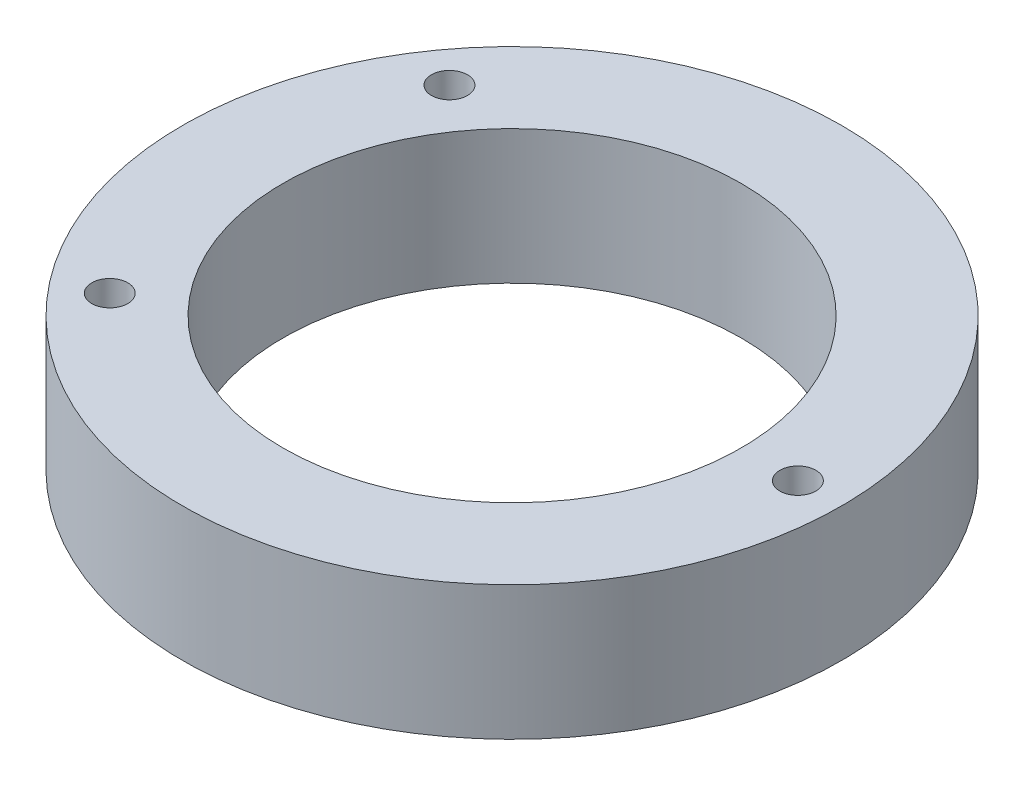
ISO-10303-21;
HEADER;
FILE_DESCRIPTION(('STEP AP214'),'2;1');
FILE_NAME('part.step','',(''),(''),'','','');
FILE_SCHEMA(('AUTOMOTIVE_DESIGN { 1 0 10303 214 1 1 1 1 }'));
ENDSEC;
DATA;
#1=APPLICATION_CONTEXT('core data for automotive mechanical design processes');
#2=APPLICATION_PROTOCOL_DEFINITION('international standard','automotive_design',2000,#1);
#3=PRODUCT_CONTEXT('',#1,'mechanical');
#4=PRODUCT('Part','Part','',(#3));
#5=PRODUCT_RELATED_PRODUCT_CATEGORY('part','',(#4));
#6=PRODUCT_DEFINITION_FORMATION('','',#4);
#7=PRODUCT_DEFINITION_CONTEXT('part definition',#1,'design');
#8=PRODUCT_DEFINITION('design','',#6,#7);
#9=PRODUCT_DEFINITION_SHAPE('','',#8);
#10=(LENGTH_UNIT() NAMED_UNIT(*) SI_UNIT(.MILLI.,.METRE.));
#11=(NAMED_UNIT(*) PLANE_ANGLE_UNIT() SI_UNIT($,.RADIAN.));
#12=(NAMED_UNIT(*) SI_UNIT($,.STERADIAN.) SOLID_ANGLE_UNIT());
#13=UNCERTAINTY_MEASURE_WITH_UNIT(LENGTH_MEASURE(1.E-05),#10,'distance_accuracy_value','');
#14=(GEOMETRIC_REPRESENTATION_CONTEXT(3) GLOBAL_UNCERTAINTY_ASSIGNED_CONTEXT((#13)) GLOBAL_UNIT_ASSIGNED_CONTEXT((#10,
#11,#12)) REPRESENTATION_CONTEXT('',''));
#15=CARTESIAN_POINT('',(0.,0.,0.));
#16=DIRECTION('',(0.,0.,1.));
#17=DIRECTION('',(1.,0.,0.));
#18=AXIS2_PLACEMENT_3D('',#15,#16,#17);
#19=CARTESIAN_POINT('',(0.,13.,0.));
#20=DIRECTION('',(0.,1.,0.));
#21=DIRECTION('',(0.,0.,1.));
#22=AXIS2_PLACEMENT_3D('',#19,#20,#21);
#23=PLANE('',#22);
#24=CARTESIAN_POINT('',(-22.4248308687684,13.,-16.3459310076585));
#25=DIRECTION('',(0.,1.,0.));
#26=DIRECTION('',(0.,0.,1.));
#27=AXIS2_PLACEMENT_3D('',#24,#25,#26);
#28=CIRCLE('',#27,1.75);
#29=CARTESIAN_POINT('',(-22.4248308687684,13.,-18.0959310076585));
#30=VERTEX_POINT('',#29);
#31=EDGE_CURVE('E53',#30,#30,#28,.T.);
#32=ORIENTED_EDGE('',*,*,#31,.F.);
#33=EDGE_LOOP('',(#32));
#34=FACE_BOUND('',#33,.T.);
#35=CARTESIAN_POINT('',(0.,13.,0.));
#36=DIRECTION('',(0.,1.,0.));
#37=DIRECTION('',(0.,0.,1.));
#38=AXIS2_PLACEMENT_3D('',#35,#36,#37);
#39=CIRCLE('',#38,22.25);
#40=CARTESIAN_POINT('',(0.,13.,-22.25));
#41=VERTEX_POINT('',#40);
#42=EDGE_CURVE('E42',#41,#41,#39,.T.);
#43=ORIENTED_EDGE('',*,*,#42,.F.);
#44=EDGE_LOOP('',(#43));
#45=FACE_BOUND('',#44,.T.);
#46=CARTESIAN_POINT('',(0.,13.,0.));
#47=DIRECTION('',(0.,1.,0.));
#48=DIRECTION('',(0.,0.,1.));
#49=AXIS2_PLACEMENT_3D('',#46,#47,#48);
#50=CIRCLE('',#49,32.);
#51=CARTESIAN_POINT('',(0.,13.,-32.));
#52=VERTEX_POINT('',#51);
#53=EDGE_CURVE('E10',#52,#52,#50,.T.);
#54=ORIENTED_EDGE('',*,*,#53,.T.);
#55=EDGE_LOOP('',(#54));
#56=FACE_BOUND('',#55,.T.);
#57=CARTESIAN_POINT('',(27.75,13.,0.));
#58=DIRECTION('',(0.,1.,0.));
#59=DIRECTION('',(0.,0.,1.));
#60=AXIS2_PLACEMENT_3D('',#57,#58,#59);
#61=CIRCLE('',#60,1.75);
#62=CARTESIAN_POINT('',(27.75,13.,-1.75));
#63=VERTEX_POINT('',#62);
#64=EDGE_CURVE('E47',#63,#63,#61,.T.);
#65=ORIENTED_EDGE('',*,*,#64,.F.);
#66=EDGE_LOOP('',(#65));
#67=FACE_BOUND('',#66,.T.);
#68=CARTESIAN_POINT('',(-21.4215426539359,13.,17.6402950747885));
#69=DIRECTION('',(0.,1.,0.));
#70=DIRECTION('',(0.,0.,1.));
#71=AXIS2_PLACEMENT_3D('',#68,#69,#70);
#72=CIRCLE('',#71,1.75);
#73=CARTESIAN_POINT('',(-21.4215426539359,13.,15.8902950747885));
#74=VERTEX_POINT('',#73);
#75=EDGE_CURVE('E59',#74,#74,#72,.T.);
#76=ORIENTED_EDGE('',*,*,#75,.F.);
#77=EDGE_LOOP('',(#76));
#78=FACE_BOUND('',#77,.T.);
#79=ADVANCED_FACE('F31',(#34,#45,#56,#67,#78),#23,.T.);
#80=CARTESIAN_POINT('',(0.,0.,0.));
#81=DIRECTION('',(0.,1.,0.));
#82=DIRECTION('',(0.,0.,1.));
#83=AXIS2_PLACEMENT_3D('',#80,#81,#82);
#84=PLANE('',#83);
#85=CARTESIAN_POINT('',(0.,0.,0.));
#86=DIRECTION('',(0.,1.,0.));
#87=DIRECTION('',(0.,0.,1.));
#88=AXIS2_PLACEMENT_3D('',#85,#86,#87);
#89=CIRCLE('',#88,32.);
#90=CARTESIAN_POINT('',(0.,0.,-32.));
#91=VERTEX_POINT('',#90);
#92=EDGE_CURVE('E35',#91,#91,#89,.T.);
#93=ORIENTED_EDGE('',*,*,#92,.F.);
#94=EDGE_LOOP('',(#93));
#95=FACE_BOUND('',#94,.T.);
#96=CARTESIAN_POINT('',(0.,0.,0.));
#97=DIRECTION('',(0.,1.,0.));
#98=DIRECTION('',(0.,0.,1.));
#99=AXIS2_PLACEMENT_3D('',#96,#97,#98);
#100=CIRCLE('',#99,22.25);
#101=CARTESIAN_POINT('',(0.,0.,-22.25));
#102=VERTEX_POINT('',#101);
#103=EDGE_CURVE('E44',#102,#102,#100,.T.);
#104=ORIENTED_EDGE('',*,*,#103,.T.);
#105=EDGE_LOOP('',(#104));
#106=FACE_BOUND('',#105,.T.);
#107=CARTESIAN_POINT('',(27.75,0.,0.));
#108=DIRECTION('',(0.,1.,0.));
#109=DIRECTION('',(0.,0.,1.));
#110=AXIS2_PLACEMENT_3D('',#107,#108,#109);
#111=CIRCLE('',#110,1.75);
#112=CARTESIAN_POINT('',(27.75,0.,-1.75));
#113=VERTEX_POINT('',#112);
#114=EDGE_CURVE('E50',#113,#113,#111,.T.);
#115=ORIENTED_EDGE('',*,*,#114,.T.);
#116=EDGE_LOOP('',(#115));
#117=FACE_BOUND('',#116,.T.);
#118=CARTESIAN_POINT('',(-22.4248308687684,0.,-16.3459310076585));
#119=DIRECTION('',(0.,1.,0.));
#120=DIRECTION('',(0.,0.,1.));
#121=AXIS2_PLACEMENT_3D('',#118,#119,#120);
#122=CIRCLE('',#121,1.75);
#123=CARTESIAN_POINT('',(-22.4248308687684,0.,-18.0959310076585));
#124=VERTEX_POINT('',#123);
#125=EDGE_CURVE('E56',#124,#124,#122,.T.);
#126=ORIENTED_EDGE('',*,*,#125,.T.);
#127=EDGE_LOOP('',(#126));
#128=FACE_BOUND('',#127,.T.);
#129=CARTESIAN_POINT('',(-21.4215426539359,0.,17.6402950747885));
#130=DIRECTION('',(0.,1.,0.));
#131=DIRECTION('',(0.,0.,1.));
#132=AXIS2_PLACEMENT_3D('',#129,#130,#131);
#133=CIRCLE('',#132,1.75);
#134=CARTESIAN_POINT('',(-21.4215426539359,0.,15.8902950747885));
#135=VERTEX_POINT('',#134);
#136=EDGE_CURVE('E62',#135,#135,#133,.T.);
#137=ORIENTED_EDGE('',*,*,#136,.T.);
#138=EDGE_LOOP('',(#137));
#139=FACE_BOUND('',#138,.T.);
#140=ADVANCED_FACE('F72',(#95,#106,#117,#128,#139),#84,.F.);
#141=CARTESIAN_POINT('',(0.,13.,0.));
#142=DIRECTION('',(0.,-1.,0.));
#143=DIRECTION('',(0.,0.,-1.));
#144=AXIS2_PLACEMENT_3D('',#141,#142,#143);
#145=CYLINDRICAL_SURFACE('',#144,32.);
#146=CARTESIAN_POINT('',(0.,13.,-32.));
#147=CARTESIAN_POINT('',(0.,12.8645833333333,-32.));
#148=CARTESIAN_POINT('',(0.,12.7291666666667,-32.));
#149=CARTESIAN_POINT('',(0.,12.4583333333333,-32.));
#150=CARTESIAN_POINT('',(0.,12.3229166666667,-32.));
#151=CARTESIAN_POINT('',(0.,12.0520833333333,-32.));
#152=CARTESIAN_POINT('',(0.,11.9166666666667,-32.));
#153=CARTESIAN_POINT('',(0.,11.6458333333333,-32.));
#154=CARTESIAN_POINT('',(0.,11.5104166666667,-32.));
#155=CARTESIAN_POINT('',(0.,11.2395833333333,-32.));
#156=CARTESIAN_POINT('',(0.,11.1041666666667,-32.));
#157=CARTESIAN_POINT('',(0.,10.8333333333333,-32.));
#158=CARTESIAN_POINT('',(0.,10.6979166666667,-32.));
#159=CARTESIAN_POINT('',(0.,10.4270833333333,-32.));
#160=CARTESIAN_POINT('',(0.,10.2916666666667,-32.));
#161=CARTESIAN_POINT('',(0.,10.0208333333333,-32.));
#162=CARTESIAN_POINT('',(0.,9.88541666666667,-32.));
#163=CARTESIAN_POINT('',(0.,9.61458333333333,-32.));
#164=CARTESIAN_POINT('',(0.,9.47916666666667,-32.));
#165=CARTESIAN_POINT('',(0.,9.20833333333333,-32.));
#166=CARTESIAN_POINT('',(0.,9.07291666666667,-32.));
#167=CARTESIAN_POINT('',(0.,8.80208333333333,-32.));
#168=CARTESIAN_POINT('',(0.,8.66666666666667,-32.));
#169=CARTESIAN_POINT('',(0.,8.39583333333333,-32.));
#170=CARTESIAN_POINT('',(0.,8.26041666666667,-32.));
#171=CARTESIAN_POINT('',(0.,7.98958333333333,-32.));
#172=CARTESIAN_POINT('',(0.,7.85416666666667,-32.));
#173=CARTESIAN_POINT('',(0.,7.58333333333333,-32.));
#174=CARTESIAN_POINT('',(0.,7.44791666666667,-32.));
#175=CARTESIAN_POINT('',(0.,7.17708333333333,-32.));
#176=CARTESIAN_POINT('',(0.,7.04166666666667,-32.));
#177=CARTESIAN_POINT('',(0.,6.77083333333333,-32.));
#178=CARTESIAN_POINT('',(0.,6.63541666666667,-32.));
#179=CARTESIAN_POINT('',(0.,6.36458333333333,-32.));
#180=CARTESIAN_POINT('',(0.,6.22916666666667,-32.));
#181=CARTESIAN_POINT('',(0.,5.95833333333333,-32.));
#182=CARTESIAN_POINT('',(0.,5.82291666666667,-32.));
#183=CARTESIAN_POINT('',(0.,5.55208333333333,-32.));
#184=CARTESIAN_POINT('',(0.,5.41666666666667,-32.));
#185=CARTESIAN_POINT('',(0.,5.14583333333333,-32.));
#186=CARTESIAN_POINT('',(0.,5.01041666666667,-32.));
#187=CARTESIAN_POINT('',(0.,4.73958333333333,-32.));
#188=CARTESIAN_POINT('',(0.,4.60416666666667,-32.));
#189=CARTESIAN_POINT('',(0.,4.33333333333333,-32.));
#190=CARTESIAN_POINT('',(0.,4.19791666666667,-32.));
#191=CARTESIAN_POINT('',(0.,3.92708333333333,-32.));
#192=CARTESIAN_POINT('',(0.,3.79166666666667,-32.));
#193=CARTESIAN_POINT('',(0.,3.52083333333333,-32.));
#194=CARTESIAN_POINT('',(0.,3.38541666666667,-32.));
#195=CARTESIAN_POINT('',(0.,3.11458333333333,-32.));
#196=CARTESIAN_POINT('',(0.,2.97916666666667,-32.));
#197=CARTESIAN_POINT('',(0.,2.70833333333333,-32.));
#198=CARTESIAN_POINT('',(0.,2.57291666666667,-32.));
#199=CARTESIAN_POINT('',(0.,2.30208333333333,-32.));
#200=CARTESIAN_POINT('',(0.,2.16666666666667,-32.));
#201=CARTESIAN_POINT('',(0.,1.89583333333333,-32.));
#202=CARTESIAN_POINT('',(0.,1.76041666666667,-32.));
#203=CARTESIAN_POINT('',(0.,1.48958333333333,-32.));
#204=CARTESIAN_POINT('',(0.,1.35416666666667,-32.));
#205=CARTESIAN_POINT('',(0.,1.08333333333333,-32.));
#206=CARTESIAN_POINT('',(0.,0.947916666666667,-32.));
#207=CARTESIAN_POINT('',(0.,0.677083333333334,-32.));
#208=CARTESIAN_POINT('',(0.,0.541666666666667,-32.));
#209=CARTESIAN_POINT('',(0.,0.270833333333334,-32.));
#210=CARTESIAN_POINT('',(0.,0.135416666666667,-32.));
#211=CARTESIAN_POINT('',(0.,0.,-32.));
#212=B_SPLINE_CURVE_WITH_KNOTS('',3,(#146,#147,#148,#149,#150,#151,#152,#153,#154,#155,#156,
#157,#158,#159,#160,#161,#162,#163,#164,#165,#166,#167,#168,#169,#170,#171,#172,#173,#174,#175,
#176,#177,#178,#179,#180,#181,#182,#183,#184,#185,#186,#187,#188,#189,#190,#191,#192,#193,#194,
#195,#196,#197,#198,#199,#200,#201,#202,#203,#204,#205,#206,#207,#208,#209,#210,#211),
.UNSPECIFIED.,.F.,.F.,(4,2,2,2,2,2,2,2,2,2,2,2,2,2,2,2,2,2,2,2,2,2,2,2,2,2,2,2,2,2,2,2,4),(0.,
0.406249999999999,0.812499999999999,1.21875,1.625,2.03125,2.4375,2.84375,3.25,3.65625,4.0625,
4.46875,4.875,5.28125,5.6875,6.09375,6.5,6.90625,7.3125,7.71875,8.125,8.53125,8.9375,9.34375,
9.75,10.15625,10.5625,10.96875,11.375,11.78125,12.1875,12.59375,13.),.UNSPECIFIED.);
#213=EDGE_CURVE('BSEAM33',#52,#91,#212,.T.);
#214=ORIENTED_EDGE('',*,*,#53,.F.);
#215=ORIENTED_EDGE('',*,*,#92,.T.);
#216=ORIENTED_EDGE('',*,*,#213,.T.);
#217=ORIENTED_EDGE('',*,*,#213,.F.);
#218=EDGE_LOOP('',(#214,#216,#215,#217));
#219=FACE_BOUND('',#218,.T.);
#220=ADVANCED_FACE('F33',(#219),#145,.T.);
#221=CARTESIAN_POINT('',(0.,13.,0.));
#222=DIRECTION('',(0.,-1.,0.));
#223=DIRECTION('',(0.,0.,-1.));
#224=AXIS2_PLACEMENT_3D('',#221,#222,#223);
#225=CYLINDRICAL_SURFACE('',#224,22.25);
#226=CARTESIAN_POINT('',(0.,13.,-22.25));
#227=CARTESIAN_POINT('',(0.,12.8645833333333,-22.25));
#228=CARTESIAN_POINT('',(0.,12.7291666666667,-22.25));
#229=CARTESIAN_POINT('',(0.,12.4583333333333,-22.25));
#230=CARTESIAN_POINT('',(0.,12.3229166666667,-22.25));
#231=CARTESIAN_POINT('',(0.,12.0520833333333,-22.25));
#232=CARTESIAN_POINT('',(0.,11.9166666666667,-22.25));
#233=CARTESIAN_POINT('',(0.,11.6458333333333,-22.25));
#234=CARTESIAN_POINT('',(0.,11.5104166666667,-22.25));
#235=CARTESIAN_POINT('',(0.,11.2395833333333,-22.25));
#236=CARTESIAN_POINT('',(0.,11.1041666666667,-22.25));
#237=CARTESIAN_POINT('',(0.,10.8333333333333,-22.25));
#238=CARTESIAN_POINT('',(0.,10.6979166666667,-22.25));
#239=CARTESIAN_POINT('',(0.,10.4270833333333,-22.25));
#240=CARTESIAN_POINT('',(0.,10.2916666666667,-22.25));
#241=CARTESIAN_POINT('',(0.,10.0208333333333,-22.25));
#242=CARTESIAN_POINT('',(0.,9.88541666666667,-22.25));
#243=CARTESIAN_POINT('',(0.,9.61458333333333,-22.25));
#244=CARTESIAN_POINT('',(0.,9.47916666666667,-22.25));
#245=CARTESIAN_POINT('',(0.,9.20833333333333,-22.25));
#246=CARTESIAN_POINT('',(0.,9.07291666666667,-22.25));
#247=CARTESIAN_POINT('',(0.,8.80208333333333,-22.25));
#248=CARTESIAN_POINT('',(0.,8.66666666666667,-22.25));
#249=CARTESIAN_POINT('',(0.,8.39583333333333,-22.25));
#250=CARTESIAN_POINT('',(0.,8.26041666666667,-22.25));
#251=CARTESIAN_POINT('',(0.,7.98958333333333,-22.25));
#252=CARTESIAN_POINT('',(0.,7.85416666666667,-22.25));
#253=CARTESIAN_POINT('',(0.,7.58333333333333,-22.25));
#254=CARTESIAN_POINT('',(0.,7.44791666666667,-22.25));
#255=CARTESIAN_POINT('',(0.,7.17708333333333,-22.25));
#256=CARTESIAN_POINT('',(0.,7.04166666666667,-22.25));
#257=CARTESIAN_POINT('',(0.,6.77083333333333,-22.25));
#258=CARTESIAN_POINT('',(0.,6.63541666666667,-22.25));
#259=CARTESIAN_POINT('',(0.,6.36458333333333,-22.25));
#260=CARTESIAN_POINT('',(0.,6.22916666666667,-22.25));
#261=CARTESIAN_POINT('',(0.,5.95833333333333,-22.25));
#262=CARTESIAN_POINT('',(0.,5.82291666666667,-22.25));
#263=CARTESIAN_POINT('',(0.,5.55208333333333,-22.25));
#264=CARTESIAN_POINT('',(0.,5.41666666666667,-22.25));
#265=CARTESIAN_POINT('',(0.,5.14583333333333,-22.25));
#266=CARTESIAN_POINT('',(0.,5.01041666666667,-22.25));
#267=CARTESIAN_POINT('',(0.,4.73958333333333,-22.25));
#268=CARTESIAN_POINT('',(0.,4.60416666666667,-22.25));
#269=CARTESIAN_POINT('',(0.,4.33333333333333,-22.25));
#270=CARTESIAN_POINT('',(0.,4.19791666666667,-22.25));
#271=CARTESIAN_POINT('',(0.,3.92708333333333,-22.25));
#272=CARTESIAN_POINT('',(0.,3.79166666666667,-22.25));
#273=CARTESIAN_POINT('',(0.,3.52083333333333,-22.25));
#274=CARTESIAN_POINT('',(0.,3.38541666666667,-22.25));
#275=CARTESIAN_POINT('',(0.,3.11458333333333,-22.25));
#276=CARTESIAN_POINT('',(0.,2.97916666666667,-22.25));
#277=CARTESIAN_POINT('',(0.,2.70833333333333,-22.25));
#278=CARTESIAN_POINT('',(0.,2.57291666666667,-22.25));
#279=CARTESIAN_POINT('',(0.,2.30208333333333,-22.25));
#280=CARTESIAN_POINT('',(0.,2.16666666666667,-22.25));
#281=CARTESIAN_POINT('',(0.,1.89583333333333,-22.25));
#282=CARTESIAN_POINT('',(0.,1.76041666666667,-22.25));
#283=CARTESIAN_POINT('',(0.,1.48958333333333,-22.25));
#284=CARTESIAN_POINT('',(0.,1.35416666666667,-22.25));
#285=CARTESIAN_POINT('',(0.,1.08333333333333,-22.25));
#286=CARTESIAN_POINT('',(0.,0.947916666666667,-22.25));
#287=CARTESIAN_POINT('',(0.,0.677083333333334,-22.25));
#288=CARTESIAN_POINT('',(0.,0.541666666666667,-22.25));
#289=CARTESIAN_POINT('',(0.,0.270833333333334,-22.25));
#290=CARTESIAN_POINT('',(0.,0.135416666666667,-22.25));
#291=CARTESIAN_POINT('',(0.,0.,-22.25));
#292=B_SPLINE_CURVE_WITH_KNOTS('',3,(#226,#227,#228,#229,#230,#231,#232,#233,#234,#235,#236,
#237,#238,#239,#240,#241,#242,#243,#244,#245,#246,#247,#248,#249,#250,#251,#252,#253,#254,#255,
#256,#257,#258,#259,#260,#261,#262,#263,#264,#265,#266,#267,#268,#269,#270,#271,#272,#273,#274,
#275,#276,#277,#278,#279,#280,#281,#282,#283,#284,#285,#286,#287,#288,#289,#290,#291),
.UNSPECIFIED.,.F.,.F.,(4,2,2,2,2,2,2,2,2,2,2,2,2,2,2,2,2,2,2,2,2,2,2,2,2,2,2,2,2,2,2,2,4),(0.,
0.406249999999999,0.812499999999999,1.21875,1.625,2.03125,2.4375,2.84375,3.25,3.65625,4.0625,
4.46875,4.875,5.28125,5.6875,6.09375,6.5,6.90625,7.3125,7.71875,8.125,8.53125,8.9375,9.34375,
9.75,10.15625,10.5625,10.96875,11.375,11.78125,12.1875,12.59375,13.),.UNSPECIFIED.);
#293=EDGE_CURVE('BSEAM82',#41,#102,#292,.T.);
#294=ORIENTED_EDGE('',*,*,#42,.T.);
#295=ORIENTED_EDGE('',*,*,#103,.F.);
#296=ORIENTED_EDGE('',*,*,#293,.T.);
#297=ORIENTED_EDGE('',*,*,#293,.F.);
#298=EDGE_LOOP('',(#294,#296,#295,#297));
#299=FACE_BOUND('',#298,.T.);
#300=ADVANCED_FACE('F82',(#299),#225,.F.);
#301=CARTESIAN_POINT('',(27.75,13.,0.));
#302=DIRECTION('',(0.,-1.,0.));
#303=DIRECTION('',(0.,0.,-1.));
#304=AXIS2_PLACEMENT_3D('',#301,#302,#303);
#305=CYLINDRICAL_SURFACE('',#304,1.75);
#306=CARTESIAN_POINT('',(27.75,13.,-1.75));
#307=CARTESIAN_POINT('',(27.75,12.8645833333333,-1.75));
#308=CARTESIAN_POINT('',(27.75,12.7291666666667,-1.75));
#309=CARTESIAN_POINT('',(27.75,12.4583333333333,-1.75));
#310=CARTESIAN_POINT('',(27.75,12.3229166666667,-1.75));
#311=CARTESIAN_POINT('',(27.75,12.0520833333333,-1.75));
#312=CARTESIAN_POINT('',(27.75,11.9166666666667,-1.75));
#313=CARTESIAN_POINT('',(27.75,11.6458333333333,-1.75));
#314=CARTESIAN_POINT('',(27.75,11.5104166666667,-1.75));
#315=CARTESIAN_POINT('',(27.75,11.2395833333333,-1.75));
#316=CARTESIAN_POINT('',(27.75,11.1041666666667,-1.75));
#317=CARTESIAN_POINT('',(27.75,10.8333333333333,-1.75));
#318=CARTESIAN_POINT('',(27.75,10.6979166666667,-1.75));
#319=CARTESIAN_POINT('',(27.75,10.4270833333333,-1.75));
#320=CARTESIAN_POINT('',(27.75,10.2916666666667,-1.75));
#321=CARTESIAN_POINT('',(27.75,10.0208333333333,-1.75));
#322=CARTESIAN_POINT('',(27.75,9.88541666666667,-1.75));
#323=CARTESIAN_POINT('',(27.75,9.61458333333333,-1.75));
#324=CARTESIAN_POINT('',(27.75,9.47916666666667,-1.75));
#325=CARTESIAN_POINT('',(27.75,9.20833333333333,-1.75));
#326=CARTESIAN_POINT('',(27.75,9.07291666666667,-1.75));
#327=CARTESIAN_POINT('',(27.75,8.80208333333333,-1.75));
#328=CARTESIAN_POINT('',(27.75,8.66666666666667,-1.75));
#329=CARTESIAN_POINT('',(27.75,8.39583333333333,-1.75));
#330=CARTESIAN_POINT('',(27.75,8.26041666666667,-1.75));
#331=CARTESIAN_POINT('',(27.75,7.98958333333333,-1.75));
#332=CARTESIAN_POINT('',(27.75,7.85416666666667,-1.75));
#333=CARTESIAN_POINT('',(27.75,7.58333333333333,-1.75));
#334=CARTESIAN_POINT('',(27.75,7.44791666666667,-1.75));
#335=CARTESIAN_POINT('',(27.75,7.17708333333333,-1.75));
#336=CARTESIAN_POINT('',(27.75,7.04166666666667,-1.75));
#337=CARTESIAN_POINT('',(27.75,6.77083333333333,-1.75));
#338=CARTESIAN_POINT('',(27.75,6.63541666666667,-1.75));
#339=CARTESIAN_POINT('',(27.75,6.36458333333333,-1.75));
#340=CARTESIAN_POINT('',(27.75,6.22916666666667,-1.75));
#341=CARTESIAN_POINT('',(27.75,5.95833333333333,-1.75));
#342=CARTESIAN_POINT('',(27.75,5.82291666666667,-1.75));
#343=CARTESIAN_POINT('',(27.75,5.55208333333333,-1.75));
#344=CARTESIAN_POINT('',(27.75,5.41666666666667,-1.75));
#345=CARTESIAN_POINT('',(27.75,5.14583333333333,-1.75));
#346=CARTESIAN_POINT('',(27.75,5.01041666666667,-1.75));
#347=CARTESIAN_POINT('',(27.75,4.73958333333333,-1.75));
#348=CARTESIAN_POINT('',(27.75,4.60416666666667,-1.75));
#349=CARTESIAN_POINT('',(27.75,4.33333333333333,-1.75));
#350=CARTESIAN_POINT('',(27.75,4.19791666666667,-1.75));
#351=CARTESIAN_POINT('',(27.75,3.92708333333333,-1.75));
#352=CARTESIAN_POINT('',(27.75,3.79166666666667,-1.75));
#353=CARTESIAN_POINT('',(27.75,3.52083333333333,-1.75));
#354=CARTESIAN_POINT('',(27.75,3.38541666666667,-1.75));
#355=CARTESIAN_POINT('',(27.75,3.11458333333333,-1.75));
#356=CARTESIAN_POINT('',(27.75,2.97916666666667,-1.75));
#357=CARTESIAN_POINT('',(27.75,2.70833333333333,-1.75));
#358=CARTESIAN_POINT('',(27.75,2.57291666666667,-1.75));
#359=CARTESIAN_POINT('',(27.75,2.30208333333333,-1.75));
#360=CARTESIAN_POINT('',(27.75,2.16666666666667,-1.75));
#361=CARTESIAN_POINT('',(27.75,1.89583333333333,-1.75));
#362=CARTESIAN_POINT('',(27.75,1.76041666666667,-1.75));
#363=CARTESIAN_POINT('',(27.75,1.48958333333333,-1.75));
#364=CARTESIAN_POINT('',(27.75,1.35416666666667,-1.75));
#365=CARTESIAN_POINT('',(27.75,1.08333333333333,-1.75));
#366=CARTESIAN_POINT('',(27.75,0.947916666666667,-1.75));
#367=CARTESIAN_POINT('',(27.75,0.677083333333334,-1.75));
#368=CARTESIAN_POINT('',(27.75,0.541666666666667,-1.75));
#369=CARTESIAN_POINT('',(27.75,0.270833333333334,-1.75));
#370=CARTESIAN_POINT('',(27.75,0.135416666666667,-1.75));
#371=CARTESIAN_POINT('',(27.75,0.,-1.75));
#372=B_SPLINE_CURVE_WITH_KNOTS('',3,(#306,#307,#308,#309,#310,#311,#312,#313,#314,#315,#316,
#317,#318,#319,#320,#321,#322,#323,#324,#325,#326,#327,#328,#329,#330,#331,#332,#333,#334,#335,
#336,#337,#338,#339,#340,#341,#342,#343,#344,#345,#346,#347,#348,#349,#350,#351,#352,#353,#354,
#355,#356,#357,#358,#359,#360,#361,#362,#363,#364,#365,#366,#367,#368,#369,#370,#371),
.UNSPECIFIED.,.F.,.F.,(4,2,2,2,2,2,2,2,2,2,2,2,2,2,2,2,2,2,2,2,2,2,2,2,2,2,2,2,2,2,2,2,4),(0.,
0.406249999999999,0.812499999999999,1.21875,1.625,2.03125,2.4375,2.84375,3.25,3.65625,4.0625,
4.46875,4.875,5.28125,5.6875,6.09375,6.5,6.90625,7.3125,7.71875,8.125,8.53125,8.9375,9.34375,
9.75,10.15625,10.5625,10.96875,11.375,11.78125,12.1875,12.59375,13.),.UNSPECIFIED.);
#373=EDGE_CURVE('BSEAM85',#63,#113,#372,.T.);
#374=ORIENTED_EDGE('',*,*,#64,.T.);
#375=ORIENTED_EDGE('',*,*,#114,.F.);
#376=ORIENTED_EDGE('',*,*,#373,.T.);
#377=ORIENTED_EDGE('',*,*,#373,.F.);
#378=EDGE_LOOP('',(#374,#376,#375,#377));
#379=FACE_BOUND('',#378,.T.);
#380=ADVANCED_FACE('F85',(#379),#305,.F.);
#381=CARTESIAN_POINT('',(-22.4248308687684,13.,-16.3459310076585));
#382=DIRECTION('',(0.,-1.,0.));
#383=DIRECTION('',(0.,0.,-1.));
#384=AXIS2_PLACEMENT_3D('',#381,#382,#383);
#385=CYLINDRICAL_SURFACE('',#384,1.75);
#386=CARTESIAN_POINT('',(-22.4248308687684,13.,-18.0959310076585));
#387=CARTESIAN_POINT('',(-22.4248308687684,12.8645833333333,-18.0959310076585));
#388=CARTESIAN_POINT('',(-22.4248308687684,12.7291666666667,-18.0959310076585));
#389=CARTESIAN_POINT('',(-22.4248308687684,12.4583333333333,-18.0959310076585));
#390=CARTESIAN_POINT('',(-22.4248308687684,12.3229166666667,-18.0959310076585));
#391=CARTESIAN_POINT('',(-22.4248308687684,12.0520833333333,-18.0959310076585));
#392=CARTESIAN_POINT('',(-22.4248308687684,11.9166666666667,-18.0959310076585));
#393=CARTESIAN_POINT('',(-22.4248308687684,11.6458333333333,-18.0959310076585));
#394=CARTESIAN_POINT('',(-22.4248308687684,11.5104166666667,-18.0959310076585));
#395=CARTESIAN_POINT('',(-22.4248308687684,11.2395833333333,-18.0959310076585));
#396=CARTESIAN_POINT('',(-22.4248308687684,11.1041666666667,-18.0959310076585));
#397=CARTESIAN_POINT('',(-22.4248308687684,10.8333333333333,-18.0959310076585));
#398=CARTESIAN_POINT('',(-22.4248308687684,10.6979166666667,-18.0959310076585));
#399=CARTESIAN_POINT('',(-22.4248308687684,10.4270833333333,-18.0959310076585));
#400=CARTESIAN_POINT('',(-22.4248308687684,10.2916666666667,-18.0959310076585));
#401=CARTESIAN_POINT('',(-22.4248308687684,10.0208333333333,-18.0959310076585));
#402=CARTESIAN_POINT('',(-22.4248308687684,9.88541666666667,-18.0959310076585));
#403=CARTESIAN_POINT('',(-22.4248308687684,9.61458333333333,-18.0959310076585));
#404=CARTESIAN_POINT('',(-22.4248308687684,9.47916666666667,-18.0959310076585));
#405=CARTESIAN_POINT('',(-22.4248308687684,9.20833333333333,-18.0959310076585));
#406=CARTESIAN_POINT('',(-22.4248308687684,9.07291666666667,-18.0959310076585));
#407=CARTESIAN_POINT('',(-22.4248308687684,8.80208333333333,-18.0959310076585));
#408=CARTESIAN_POINT('',(-22.4248308687684,8.66666666666667,-18.0959310076585));
#409=CARTESIAN_POINT('',(-22.4248308687684,8.39583333333333,-18.0959310076585));
#410=CARTESIAN_POINT('',(-22.4248308687684,8.26041666666667,-18.0959310076585));
#411=CARTESIAN_POINT('',(-22.4248308687684,7.98958333333333,-18.0959310076585));
#412=CARTESIAN_POINT('',(-22.4248308687684,7.85416666666667,-18.0959310076585));
#413=CARTESIAN_POINT('',(-22.4248308687684,7.58333333333333,-18.0959310076585));
#414=CARTESIAN_POINT('',(-22.4248308687684,7.44791666666667,-18.0959310076585));
#415=CARTESIAN_POINT('',(-22.4248308687684,7.17708333333333,-18.0959310076585));
#416=CARTESIAN_POINT('',(-22.4248308687684,7.04166666666667,-18.0959310076585));
#417=CARTESIAN_POINT('',(-22.4248308687684,6.77083333333333,-18.0959310076585));
#418=CARTESIAN_POINT('',(-22.4248308687684,6.63541666666667,-18.0959310076585));
#419=CARTESIAN_POINT('',(-22.4248308687684,6.36458333333333,-18.0959310076585));
#420=CARTESIAN_POINT('',(-22.4248308687684,6.22916666666667,-18.0959310076585));
#421=CARTESIAN_POINT('',(-22.4248308687684,5.95833333333333,-18.0959310076585));
#422=CARTESIAN_POINT('',(-22.4248308687684,5.82291666666667,-18.0959310076585));
#423=CARTESIAN_POINT('',(-22.4248308687684,5.55208333333333,-18.0959310076585));
#424=CARTESIAN_POINT('',(-22.4248308687684,5.41666666666667,-18.0959310076585));
#425=CARTESIAN_POINT('',(-22.4248308687684,5.14583333333333,-18.0959310076585));
#426=CARTESIAN_POINT('',(-22.4248308687684,5.01041666666667,-18.0959310076585));
#427=CARTESIAN_POINT('',(-22.4248308687684,4.73958333333333,-18.0959310076585));
#428=CARTESIAN_POINT('',(-22.4248308687684,4.60416666666667,-18.0959310076585));
#429=CARTESIAN_POINT('',(-22.4248308687684,4.33333333333333,-18.0959310076585));
#430=CARTESIAN_POINT('',(-22.4248308687684,4.19791666666667,-18.0959310076585));
#431=CARTESIAN_POINT('',(-22.4248308687684,3.92708333333333,-18.0959310076585));
#432=CARTESIAN_POINT('',(-22.4248308687684,3.79166666666667,-18.0959310076585));
#433=CARTESIAN_POINT('',(-22.4248308687684,3.52083333333333,-18.0959310076585));
#434=CARTESIAN_POINT('',(-22.4248308687684,3.38541666666667,-18.0959310076585));
#435=CARTESIAN_POINT('',(-22.4248308687684,3.11458333333333,-18.0959310076585));
#436=CARTESIAN_POINT('',(-22.4248308687684,2.97916666666667,-18.0959310076585));
#437=CARTESIAN_POINT('',(-22.4248308687684,2.70833333333333,-18.0959310076585));
#438=CARTESIAN_POINT('',(-22.4248308687684,2.57291666666667,-18.0959310076585));
#439=CARTESIAN_POINT('',(-22.4248308687684,2.30208333333333,-18.0959310076585));
#440=CARTESIAN_POINT('',(-22.4248308687684,2.16666666666667,-18.0959310076585));
#441=CARTESIAN_POINT('',(-22.4248308687684,1.89583333333333,-18.0959310076585));
#442=CARTESIAN_POINT('',(-22.4248308687684,1.76041666666667,-18.0959310076585));
#443=CARTESIAN_POINT('',(-22.4248308687684,1.48958333333333,-18.0959310076585));
#444=CARTESIAN_POINT('',(-22.4248308687684,1.35416666666667,-18.0959310076585));
#445=CARTESIAN_POINT('',(-22.4248308687684,1.08333333333333,-18.0959310076585));
#446=CARTESIAN_POINT('',(-22.4248308687684,0.947916666666667,-18.0959310076585));
#447=CARTESIAN_POINT('',(-22.4248308687684,0.677083333333334,-18.0959310076585));
#448=CARTESIAN_POINT('',(-22.4248308687684,0.541666666666667,-18.0959310076585));
#449=CARTESIAN_POINT('',(-22.4248308687684,0.270833333333334,-18.0959310076585));
#450=CARTESIAN_POINT('',(-22.4248308687684,0.135416666666667,-18.0959310076585));
#451=CARTESIAN_POINT('',(-22.4248308687684,0.,-18.0959310076585));
#452=B_SPLINE_CURVE_WITH_KNOTS('',3,(#386,#387,#388,#389,#390,#391,#392,#393,#394,#395,#396,
#397,#398,#399,#400,#401,#402,#403,#404,#405,#406,#407,#408,#409,#410,#411,#412,#413,#414,#415,
#416,#417,#418,#419,#420,#421,#422,#423,#424,#425,#426,#427,#428,#429,#430,#431,#432,#433,#434,
#435,#436,#437,#438,#439,#440,#441,#442,#443,#444,#445,#446,#447,#448,#449,#450,#451),
.UNSPECIFIED.,.F.,.F.,(4,2,2,2,2,2,2,2,2,2,2,2,2,2,2,2,2,2,2,2,2,2,2,2,2,2,2,2,2,2,2,2,4),(0.,
0.406249999999999,0.812499999999999,1.21875,1.625,2.03125,2.4375,2.84375,3.25,3.65625,4.0625,
4.46875,4.875,5.28125,5.6875,6.09375,6.5,6.90625,7.3125,7.71875,8.125,8.53125,8.9375,9.34375,
9.75,10.15625,10.5625,10.96875,11.375,11.78125,12.1875,12.59375,13.),.UNSPECIFIED.);
#453=EDGE_CURVE('BSEAM89',#30,#124,#452,.T.);
#454=ORIENTED_EDGE('',*,*,#31,.T.);
#455=ORIENTED_EDGE('',*,*,#125,.F.);
#456=ORIENTED_EDGE('',*,*,#453,.T.);
#457=ORIENTED_EDGE('',*,*,#453,.F.);
#458=EDGE_LOOP('',(#454,#456,#455,#457));
#459=FACE_BOUND('',#458,.T.);
#460=ADVANCED_FACE('F89',(#459),#385,.F.);
#461=CARTESIAN_POINT('',(-21.4215426539359,13.,17.6402950747885));
#462=DIRECTION('',(0.,-1.,0.));
#463=DIRECTION('',(0.,0.,-1.));
#464=AXIS2_PLACEMENT_3D('',#461,#462,#463);
#465=CYLINDRICAL_SURFACE('',#464,1.75);
#466=CARTESIAN_POINT('',(-21.4215426539359,13.,15.8902950747885));
#467=CARTESIAN_POINT('',(-21.4215426539359,12.8645833333333,15.8902950747885));
#468=CARTESIAN_POINT('',(-21.4215426539359,12.7291666666667,15.8902950747885));
#469=CARTESIAN_POINT('',(-21.4215426539359,12.4583333333333,15.8902950747885));
#470=CARTESIAN_POINT('',(-21.4215426539359,12.3229166666667,15.8902950747885));
#471=CARTESIAN_POINT('',(-21.4215426539359,12.0520833333333,15.8902950747885));
#472=CARTESIAN_POINT('',(-21.4215426539359,11.9166666666667,15.8902950747885));
#473=CARTESIAN_POINT('',(-21.4215426539359,11.6458333333333,15.8902950747885));
#474=CARTESIAN_POINT('',(-21.4215426539359,11.5104166666667,15.8902950747885));
#475=CARTESIAN_POINT('',(-21.4215426539359,11.2395833333333,15.8902950747885));
#476=CARTESIAN_POINT('',(-21.4215426539359,11.1041666666667,15.8902950747885));
#477=CARTESIAN_POINT('',(-21.4215426539359,10.8333333333333,15.8902950747885));
#478=CARTESIAN_POINT('',(-21.4215426539359,10.6979166666667,15.8902950747885));
#479=CARTESIAN_POINT('',(-21.4215426539359,10.4270833333333,15.8902950747885));
#480=CARTESIAN_POINT('',(-21.4215426539359,10.2916666666667,15.8902950747885));
#481=CARTESIAN_POINT('',(-21.4215426539359,10.0208333333333,15.8902950747885));
#482=CARTESIAN_POINT('',(-21.4215426539359,9.88541666666667,15.8902950747885));
#483=CARTESIAN_POINT('',(-21.4215426539359,9.61458333333333,15.8902950747885));
#484=CARTESIAN_POINT('',(-21.4215426539359,9.47916666666667,15.8902950747885));
#485=CARTESIAN_POINT('',(-21.4215426539359,9.20833333333333,15.8902950747885));
#486=CARTESIAN_POINT('',(-21.4215426539359,9.07291666666667,15.8902950747885));
#487=CARTESIAN_POINT('',(-21.4215426539359,8.80208333333333,15.8902950747885));
#488=CARTESIAN_POINT('',(-21.4215426539359,8.66666666666667,15.8902950747885));
#489=CARTESIAN_POINT('',(-21.4215426539359,8.39583333333333,15.8902950747885));
#490=CARTESIAN_POINT('',(-21.4215426539359,8.26041666666667,15.8902950747885));
#491=CARTESIAN_POINT('',(-21.4215426539359,7.98958333333333,15.8902950747885));
#492=CARTESIAN_POINT('',(-21.4215426539359,7.85416666666667,15.8902950747885));
#493=CARTESIAN_POINT('',(-21.4215426539359,7.58333333333333,15.8902950747885));
#494=CARTESIAN_POINT('',(-21.4215426539359,7.44791666666667,15.8902950747885));
#495=CARTESIAN_POINT('',(-21.4215426539359,7.17708333333333,15.8902950747885));
#496=CARTESIAN_POINT('',(-21.4215426539359,7.04166666666667,15.8902950747885));
#497=CARTESIAN_POINT('',(-21.4215426539359,6.77083333333333,15.8902950747885));
#498=CARTESIAN_POINT('',(-21.4215426539359,6.63541666666667,15.8902950747885));
#499=CARTESIAN_POINT('',(-21.4215426539359,6.36458333333333,15.8902950747885));
#500=CARTESIAN_POINT('',(-21.4215426539359,6.22916666666667,15.8902950747885));
#501=CARTESIAN_POINT('',(-21.4215426539359,5.95833333333333,15.8902950747885));
#502=CARTESIAN_POINT('',(-21.4215426539359,5.82291666666667,15.8902950747885));
#503=CARTESIAN_POINT('',(-21.4215426539359,5.55208333333333,15.8902950747885));
#504=CARTESIAN_POINT('',(-21.4215426539359,5.41666666666667,15.8902950747885));
#505=CARTESIAN_POINT('',(-21.4215426539359,5.14583333333333,15.8902950747885));
#506=CARTESIAN_POINT('',(-21.4215426539359,5.01041666666667,15.8902950747885));
#507=CARTESIAN_POINT('',(-21.4215426539359,4.73958333333333,15.8902950747885));
#508=CARTESIAN_POINT('',(-21.4215426539359,4.60416666666667,15.8902950747885));
#509=CARTESIAN_POINT('',(-21.4215426539359,4.33333333333333,15.8902950747885));
#510=CARTESIAN_POINT('',(-21.4215426539359,4.19791666666667,15.8902950747885));
#511=CARTESIAN_POINT('',(-21.4215426539359,3.92708333333333,15.8902950747885));
#512=CARTESIAN_POINT('',(-21.4215426539359,3.79166666666667,15.8902950747885));
#513=CARTESIAN_POINT('',(-21.4215426539359,3.52083333333333,15.8902950747885));
#514=CARTESIAN_POINT('',(-21.4215426539359,3.38541666666667,15.8902950747885));
#515=CARTESIAN_POINT('',(-21.4215426539359,3.11458333333333,15.8902950747885));
#516=CARTESIAN_POINT('',(-21.4215426539359,2.97916666666667,15.8902950747885));
#517=CARTESIAN_POINT('',(-21.4215426539359,2.70833333333333,15.8902950747885));
#518=CARTESIAN_POINT('',(-21.4215426539359,2.57291666666667,15.8902950747885));
#519=CARTESIAN_POINT('',(-21.4215426539359,2.30208333333333,15.8902950747885));
#520=CARTESIAN_POINT('',(-21.4215426539359,2.16666666666667,15.8902950747885));
#521=CARTESIAN_POINT('',(-21.4215426539359,1.89583333333333,15.8902950747885));
#522=CARTESIAN_POINT('',(-21.4215426539359,1.76041666666667,15.8902950747885));
#523=CARTESIAN_POINT('',(-21.4215426539359,1.48958333333333,15.8902950747885));
#524=CARTESIAN_POINT('',(-21.4215426539359,1.35416666666667,15.8902950747885));
#525=CARTESIAN_POINT('',(-21.4215426539359,1.08333333333333,15.8902950747885));
#526=CARTESIAN_POINT('',(-21.4215426539359,0.947916666666667,15.8902950747885));
#527=CARTESIAN_POINT('',(-21.4215426539359,0.677083333333334,15.8902950747885));
#528=CARTESIAN_POINT('',(-21.4215426539359,0.541666666666667,15.8902950747885));
#529=CARTESIAN_POINT('',(-21.4215426539359,0.270833333333334,15.8902950747885));
#530=CARTESIAN_POINT('',(-21.4215426539359,0.135416666666667,15.8902950747885));
#531=CARTESIAN_POINT('',(-21.4215426539359,0.,15.8902950747885));
#532=B_SPLINE_CURVE_WITH_KNOTS('',3,(#466,#467,#468,#469,#470,#471,#472,#473,#474,#475,#476,
#477,#478,#479,#480,#481,#482,#483,#484,#485,#486,#487,#488,#489,#490,#491,#492,#493,#494,#495,
#496,#497,#498,#499,#500,#501,#502,#503,#504,#505,#506,#507,#508,#509,#510,#511,#512,#513,#514,
#515,#516,#517,#518,#519,#520,#521,#522,#523,#524,#525,#526,#527,#528,#529,#530,#531),
.UNSPECIFIED.,.F.,.F.,(4,2,2,2,2,2,2,2,2,2,2,2,2,2,2,2,2,2,2,2,2,2,2,2,2,2,2,2,2,2,2,2,4),(0.,
0.406249999999999,0.812499999999999,1.21875,1.625,2.03125,2.4375,2.84375,3.25,3.65625,4.0625,
4.46875,4.875,5.28125,5.6875,6.09375,6.5,6.90625,7.3125,7.71875,8.125,8.53125,8.9375,9.34375,
9.75,10.15625,10.5625,10.96875,11.375,11.78125,12.1875,12.59375,13.),.UNSPECIFIED.);
#533=EDGE_CURVE('BSEAM68',#74,#135,#532,.T.);
#534=ORIENTED_EDGE('',*,*,#75,.T.);
#535=ORIENTED_EDGE('',*,*,#136,.F.);
#536=ORIENTED_EDGE('',*,*,#533,.T.);
#537=ORIENTED_EDGE('',*,*,#533,.F.);
#538=EDGE_LOOP('',(#534,#536,#535,#537));
#539=FACE_BOUND('',#538,.T.);
#540=ADVANCED_FACE('F68',(#539),#465,.F.);
#541=CLOSED_SHELL('',(#79,#140,#220,#300,#380,#460,#540));
#542=MANIFOLD_SOLID_BREP('B2',#541);
#543=ADVANCED_BREP_SHAPE_REPRESENTATION('',(#18,#542),#14);
#544=SHAPE_DEFINITION_REPRESENTATION(#9,#543);
ENDSEC;
END-ISO-10303-21;
